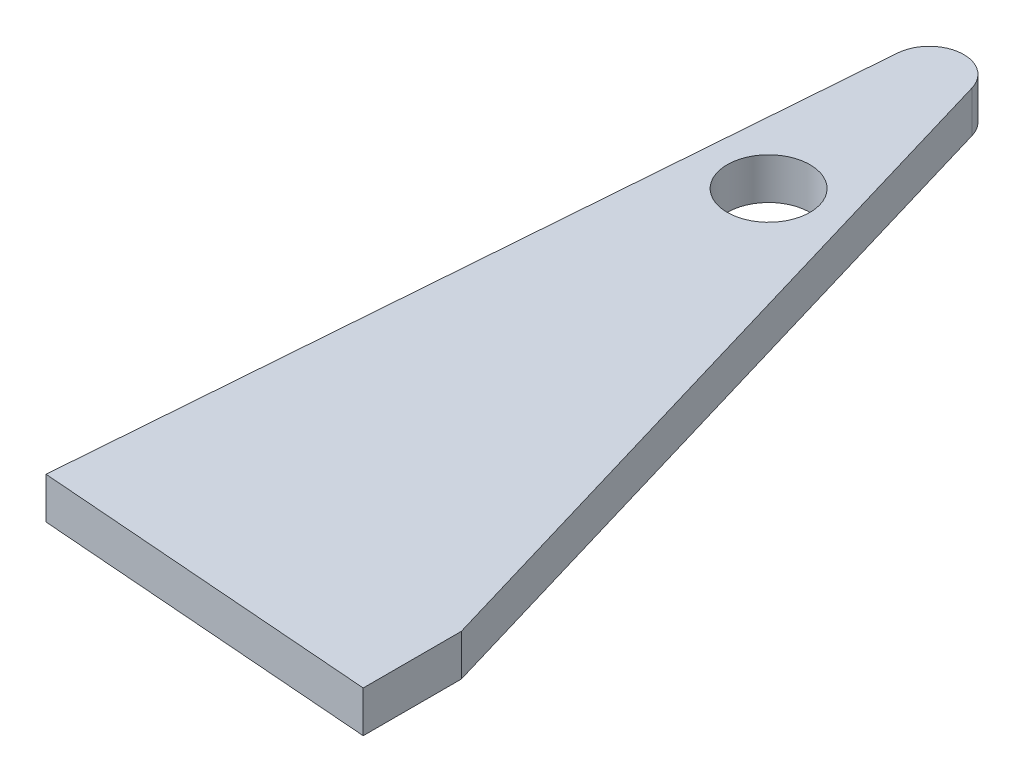
ISO-10303-21;
HEADER;
FILE_DESCRIPTION(('STEP AP214'),'2;1');
FILE_NAME('part.step','',(''),(''),'','','');
FILE_SCHEMA(('AUTOMOTIVE_DESIGN { 1 0 10303 214 1 1 1 1 }'));
ENDSEC;
DATA;
#1=APPLICATION_CONTEXT('core data for automotive mechanical design processes');
#2=APPLICATION_PROTOCOL_DEFINITION('international standard','automotive_design',2000,#1);
#3=PRODUCT_CONTEXT('',#1,'mechanical');
#4=PRODUCT('Part','Part','',(#3));
#5=PRODUCT_RELATED_PRODUCT_CATEGORY('part','',(#4));
#6=PRODUCT_DEFINITION_FORMATION('','',#4);
#7=PRODUCT_DEFINITION_CONTEXT('part definition',#1,'design');
#8=PRODUCT_DEFINITION('design','',#6,#7);
#9=PRODUCT_DEFINITION_SHAPE('','',#8);
#10=(LENGTH_UNIT() NAMED_UNIT(*) SI_UNIT(.MILLI.,.METRE.));
#11=(NAMED_UNIT(*) PLANE_ANGLE_UNIT() SI_UNIT($,.RADIAN.));
#12=(NAMED_UNIT(*) SI_UNIT($,.STERADIAN.) SOLID_ANGLE_UNIT());
#13=UNCERTAINTY_MEASURE_WITH_UNIT(LENGTH_MEASURE(1.E-05),#10,'distance_accuracy_value','');
#14=(GEOMETRIC_REPRESENTATION_CONTEXT(3) GLOBAL_UNCERTAINTY_ASSIGNED_CONTEXT((#13)) GLOBAL_UNIT_ASSIGNED_CONTEXT((#10,
#11,#12)) REPRESENTATION_CONTEXT('',''));
#15=CARTESIAN_POINT('',(0.,0.,0.));
#16=DIRECTION('',(0.,0.,1.));
#17=DIRECTION('',(1.,0.,0.));
#18=AXIS2_PLACEMENT_3D('',#15,#16,#17);
#19=CARTESIAN_POINT('',(13.8303843211245,6.,-114.274758671939));
#20=DIRECTION('',(0.,1.,0.));
#21=DIRECTION('',(0.,0.,1.));
#22=AXIS2_PLACEMENT_3D('',#19,#20,#21);
#23=PLANE('',#22);
#24=DIRECTION('',(0.997037673122917,0.,0.0769147474392165));
#25=VECTOR('',#24,1.);
#26=CARTESIAN_POINT('',(49.8518836561459,6.,3.84573737196083));
#27=LINE('',#26,#25);
#28=CARTESIAN_POINT('',(0.,6.,0.));
#29=VERTEX_POINT('',#28);
#30=CARTESIAN_POINT('',(49.8518836561459,6.,3.84573737196083));
#31=VERTEX_POINT('',#30);
#32=EDGE_CURVE('E139',#29,#31,#27,.T.);
#33=ORIENTED_EDGE('',*,*,#32,.T.);
#34=DIRECTION('',(0.,0.,-1.));
#35=VECTOR('',#34,1.);
#36=CARTESIAN_POINT('',(49.8518836561459,6.,-10.3823173268797));
#37=LINE('',#36,#35);
#38=CARTESIAN_POINT('',(49.8518836561459,6.,-10.3823173268797));
#39=VERTEX_POINT('',#38);
#40=EDGE_CURVE('E97',#31,#39,#37,.T.);
#41=ORIENTED_EDGE('',*,*,#40,.T.);
#42=DIRECTION('',(-0.284286597503992,0.,-0.95873934438908));
#43=VECTOR('',#42,1.);
#44=CARTESIAN_POINT('',(18.6240810430699,6.,-115.696191659459));
#45=LINE('',#44,#43);
#46=CARTESIAN_POINT('',(18.6240810430699,6.,-115.696191659459));
#47=VERTEX_POINT('',#46);
#48=EDGE_CURVE('E101',#39,#47,#45,.T.);
#49=ORIENTED_EDGE('',*,*,#48,.T.);
#50=CARTESIAN_POINT('',(13.8303843211245,6.,-114.274758671939));
#51=DIRECTION('',(0.,1.,0.));
#52=DIRECTION('',(0.,0.,1.));
#53=AXIS2_PLACEMENT_3D('',#50,#51,#52);
#54=CIRCLE('',#53,5.);
#55=CARTESIAN_POINT('',(8.84519595550992,6.,-114.659332409135));
#56=VERTEX_POINT('',#55);
#57=EDGE_CURVE('E105',#47,#56,#54,.T.);
#58=ORIENTED_EDGE('',*,*,#57,.T.);
#59=DIRECTION('',(-0.0769147474392167,0.,0.997037673122917));
#60=VECTOR('',#59,1.);
#61=CARTESIAN_POINT('',(0.,6.,0.));
#62=LINE('',#61,#60);
#63=EDGE_CURVE('E63',#56,#29,#62,.T.);
#64=ORIENTED_EDGE('',*,*,#63,.T.);
#65=EDGE_LOOP('',(#33,#41,#49,#58,#64));
#66=FACE_BOUND('',#65,.T.);
#67=CARTESIAN_POINT('',(16.5155532452843,6.,-88.2891150871838));
#68=DIRECTION('',(0.,1.,0.));
#69=DIRECTION('',(0.,0.,1.));
#70=AXIS2_PLACEMENT_3D('',#67,#68,#69);
#71=CIRCLE('',#70,6.00000000000001);
#72=CARTESIAN_POINT('',(16.5155532452843,6.,-82.2891150871838));
#73=VERTEX_POINT('',#72);
#74=EDGE_CURVE('E130',#73,#73,#71,.T.);
#75=ORIENTED_EDGE('',*,*,#74,.F.);
#76=EDGE_LOOP('',(#75));
#77=FACE_BOUND('',#76,.T.);
#78=ADVANCED_FACE('F45',(#66,#77),#23,.T.);
#79=CARTESIAN_POINT('',(13.8303843211245,0.,-114.274758671939));
#80=DIRECTION('',(0.,1.,0.));
#81=DIRECTION('',(0.,0.,1.));
#82=AXIS2_PLACEMENT_3D('',#79,#80,#81);
#83=PLANE('',#82);
#84=DIRECTION('',(0.997037673122917,0.,0.0769147474392165));
#85=VECTOR('',#84,1.);
#86=CARTESIAN_POINT('',(49.8518836561459,0.,3.84573737196083));
#87=LINE('',#86,#85);
#88=CARTESIAN_POINT('',(0.,0.,0.));
#89=VERTEX_POINT('',#88);
#90=CARTESIAN_POINT('',(49.8518836561459,0.,3.84573737196083));
#91=VERTEX_POINT('',#90);
#92=EDGE_CURVE('E125',#89,#91,#87,.T.);
#93=ORIENTED_EDGE('',*,*,#92,.F.);
#94=DIRECTION('',(-0.0769147474392167,0.,0.997037673122917));
#95=VECTOR('',#94,1.);
#96=CARTESIAN_POINT('',(0.,0.,0.));
#97=LINE('',#96,#95);
#98=CARTESIAN_POINT('',(8.84519595550992,0.,-114.659332409135));
#99=VERTEX_POINT('',#98);
#100=EDGE_CURVE('E89',#99,#89,#97,.T.);
#101=ORIENTED_EDGE('',*,*,#100,.F.);
#102=CARTESIAN_POINT('',(13.8303843211245,0.,-114.274758671939));
#103=DIRECTION('',(0.,1.,0.));
#104=DIRECTION('',(0.,0.,1.));
#105=AXIS2_PLACEMENT_3D('',#102,#103,#104);
#106=CIRCLE('',#105,5.);
#107=CARTESIAN_POINT('',(18.6240810430699,0.,-115.696191659459));
#108=VERTEX_POINT('',#107);
#109=EDGE_CURVE('E83',#108,#99,#106,.T.);
#110=ORIENTED_EDGE('',*,*,#109,.F.);
#111=DIRECTION('',(-0.284286597503992,0.,-0.95873934438908));
#112=VECTOR('',#111,1.);
#113=CARTESIAN_POINT('',(18.6240810430699,0.,-115.696191659459));
#114=LINE('',#113,#112);
#115=CARTESIAN_POINT('',(49.8518836561459,0.,-10.3823173268797));
#116=VERTEX_POINT('',#115);
#117=EDGE_CURVE('E113',#116,#108,#114,.T.);
#118=ORIENTED_EDGE('',*,*,#117,.F.);
#119=DIRECTION('',(0.,0.,-1.));
#120=VECTOR('',#119,1.);
#121=CARTESIAN_POINT('',(49.8518836561459,0.,-10.3823173268797));
#122=LINE('',#121,#120);
#123=EDGE_CURVE('E129',#91,#116,#122,.T.);
#124=ORIENTED_EDGE('',*,*,#123,.F.);
#125=EDGE_LOOP('',(#93,#101,#110,#118,#124));
#126=FACE_BOUND('',#125,.T.);
#127=CARTESIAN_POINT('',(16.5155532452843,0.,-88.2891150871838));
#128=DIRECTION('',(0.,1.,0.));
#129=DIRECTION('',(0.,0.,1.));
#130=AXIS2_PLACEMENT_3D('',#127,#128,#129);
#131=CIRCLE('',#130,6.00000000000001);
#132=CARTESIAN_POINT('',(16.5155532452843,0.,-82.2891150871838));
#133=VERTEX_POINT('',#132);
#134=EDGE_CURVE('E222',#133,#133,#131,.T.);
#135=ORIENTED_EDGE('',*,*,#134,.T.);
#136=EDGE_LOOP('',(#135));
#137=FACE_BOUND('',#136,.T.);
#138=ADVANCED_FACE('F146',(#126,#137),#83,.F.);
#139=CARTESIAN_POINT('',(49.8518836561459,6.,3.84573737196083));
#140=DIRECTION('',(0.0769147474392165,0.,-0.997037673122917));
#141=DIRECTION('',(-0.997037673122917,0.,-0.0769147474392165));
#142=AXIS2_PLACEMENT_3D('',#139,#140,#141);
#143=PLANE('',#142);
#144=ORIENTED_EDGE('',*,*,#92,.T.);
#145=DIRECTION('',(0.,-1.,0.));
#146=VECTOR('',#145,1.);
#147=CARTESIAN_POINT('',(49.8518836561459,6.,3.84573737196083));
#148=LINE('',#147,#146);
#149=EDGE_CURVE('E11',#31,#91,#148,.T.);
#150=ORIENTED_EDGE('',*,*,#149,.F.);
#151=ORIENTED_EDGE('',*,*,#32,.F.);
#152=DIRECTION('',(0.,-1.,0.));
#153=VECTOR('',#152,1.);
#154=CARTESIAN_POINT('',(0.,6.,0.));
#155=LINE('',#154,#153);
#156=EDGE_CURVE('E121',#29,#89,#155,.T.);
#157=ORIENTED_EDGE('',*,*,#156,.T.);
#158=EDGE_LOOP('',(#144,#150,#151,#157));
#159=FACE_BOUND('',#158,.T.);
#160=ADVANCED_FACE('F47',(#159),#143,.F.);
#161=CARTESIAN_POINT('',(49.8518836561459,6.,-10.3823173268797));
#162=DIRECTION('',(-1.,0.,0.));
#163=DIRECTION('',(0.,0.,1.));
#164=AXIS2_PLACEMENT_3D('',#161,#162,#163);
#165=PLANE('',#164);
#166=ORIENTED_EDGE('',*,*,#123,.T.);
#167=DIRECTION('',(0.,-1.,0.));
#168=VECTOR('',#167,1.);
#169=CARTESIAN_POINT('',(49.8518836561459,6.,-10.3823173268797));
#170=LINE('',#169,#168);
#171=EDGE_CURVE('E55',#39,#116,#170,.T.);
#172=ORIENTED_EDGE('',*,*,#171,.F.);
#173=ORIENTED_EDGE('',*,*,#40,.F.);
#174=ORIENTED_EDGE('',*,*,#149,.T.);
#175=EDGE_LOOP('',(#166,#172,#173,#174));
#176=FACE_BOUND('',#175,.T.);
#177=ADVANCED_FACE('F171',(#176),#165,.F.);
#178=CARTESIAN_POINT('',(18.6240810430699,6.,-115.696191659459));
#179=DIRECTION('',(-0.95873934438908,0.,0.284286597503992));
#180=DIRECTION('',(0.284286597503992,0.,0.95873934438908));
#181=AXIS2_PLACEMENT_3D('',#178,#179,#180);
#182=PLANE('',#181);
#183=ORIENTED_EDGE('',*,*,#117,.T.);
#184=DIRECTION('',(0.,-1.,0.));
#185=VECTOR('',#184,1.);
#186=CARTESIAN_POINT('',(18.6240810430699,6.,-115.696191659459));
#187=LINE('',#186,#185);
#188=EDGE_CURVE('E110',#47,#108,#187,.T.);
#189=ORIENTED_EDGE('',*,*,#188,.F.);
#190=ORIENTED_EDGE('',*,*,#48,.F.);
#191=ORIENTED_EDGE('',*,*,#171,.T.);
#192=EDGE_LOOP('',(#183,#189,#190,#191));
#193=FACE_BOUND('',#192,.T.);
#194=ADVANCED_FACE('F111',(#193),#182,.F.);
#195=CARTESIAN_POINT('',(13.8303843211245,6.,-114.274758671939));
#196=DIRECTION('',(0.,-1.,0.));
#197=DIRECTION('',(0.,0.,-1.));
#198=AXIS2_PLACEMENT_3D('',#195,#196,#197);
#199=CYLINDRICAL_SURFACE('',#198,5.);
#200=ORIENTED_EDGE('',*,*,#109,.T.);
#201=DIRECTION('',(0.,-1.,0.));
#202=VECTOR('',#201,1.);
#203=CARTESIAN_POINT('',(8.84519595550992,6.,-114.659332409135));
#204=LINE('',#203,#202);
#205=EDGE_CURVE('E115',#56,#99,#204,.T.);
#206=ORIENTED_EDGE('',*,*,#205,.F.);
#207=ORIENTED_EDGE('',*,*,#57,.F.);
#208=ORIENTED_EDGE('',*,*,#188,.T.);
#209=EDGE_LOOP('',(#200,#206,#207,#208));
#210=FACE_BOUND('',#209,.T.);
#211=ADVANCED_FACE('F117',(#210),#199,.T.);
#212=CARTESIAN_POINT('',(0.,6.,0.));
#213=DIRECTION('',(0.997037673122917,0.,0.0769147474392167));
#214=DIRECTION('',(0.0769147474392167,0.,-0.997037673122918));
#215=AXIS2_PLACEMENT_3D('',#212,#213,#214);
#216=PLANE('',#215);
#217=ORIENTED_EDGE('',*,*,#100,.T.);
#218=ORIENTED_EDGE('',*,*,#156,.F.);
#219=ORIENTED_EDGE('',*,*,#63,.F.);
#220=ORIENTED_EDGE('',*,*,#205,.T.);
#221=EDGE_LOOP('',(#217,#218,#219,#220));
#222=FACE_BOUND('',#221,.T.);
#223=ADVANCED_FACE('F151',(#222),#216,.F.);
#224=CARTESIAN_POINT('',(16.5155532452843,6.,-88.2891150871838));
#225=DIRECTION('',(0.,-1.,0.));
#226=DIRECTION('',(0.,0.,-1.));
#227=AXIS2_PLACEMENT_3D('',#224,#225,#226);
#228=CYLINDRICAL_SURFACE('',#227,6.00000000000001);
#229=ORIENTED_EDGE('',*,*,#74,.T.);
#230=EDGE_LOOP('',(#229));
#231=FACE_BOUND('',#230,.T.);
#232=ORIENTED_EDGE('',*,*,#134,.F.);
#233=EDGE_LOOP('',(#232));
#234=FACE_BOUND('',#233,.T.);
#235=ADVANCED_FACE('F153',(#231,#234),#228,.F.);
#236=CLOSED_SHELL('',(#78,#138,#160,#177,#194,#211,#223,#235));
#237=MANIFOLD_SOLID_BREP('B2',#236);
#238=ADVANCED_BREP_SHAPE_REPRESENTATION('',(#18,#237),#14);
#239=SHAPE_DEFINITION_REPRESENTATION(#9,#238);
ENDSEC;
END-ISO-10303-21;
